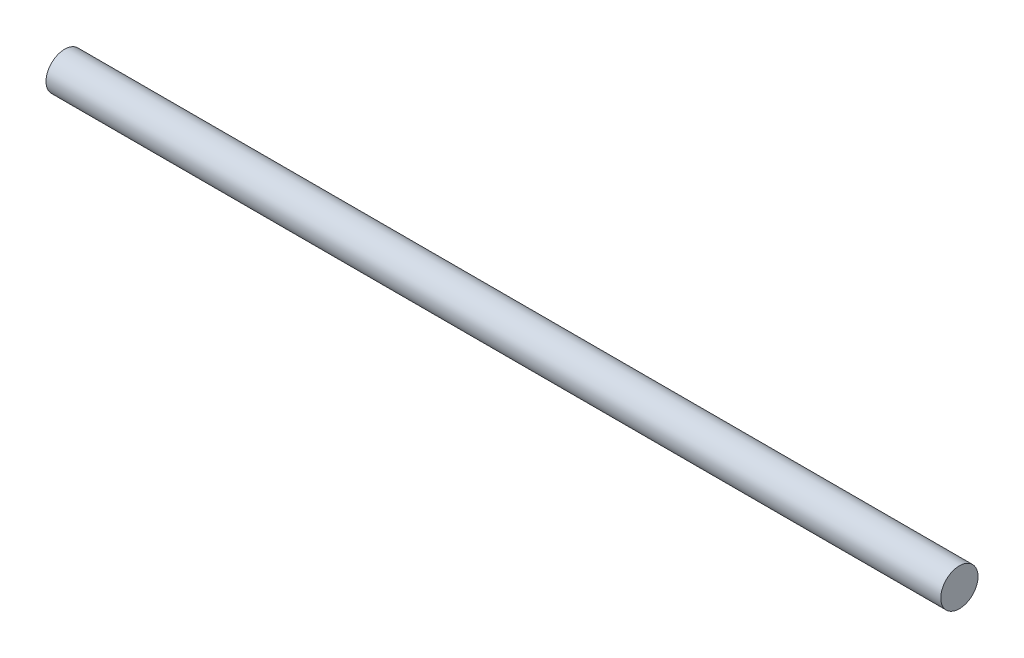
ISO-10303-21;
HEADER;
FILE_DESCRIPTION(('STEP AP214'),'2;1');
FILE_NAME('part.step','',(''),(''),'','','');
FILE_SCHEMA(('AUTOMOTIVE_DESIGN { 1 0 10303 214 1 1 1 1 }'));
ENDSEC;
DATA;
#1=APPLICATION_CONTEXT('core data for automotive mechanical design processes');
#2=APPLICATION_PROTOCOL_DEFINITION('international standard','automotive_design',2000,#1);
#3=PRODUCT_CONTEXT('',#1,'mechanical');
#4=PRODUCT('Part','Part','',(#3));
#5=PRODUCT_RELATED_PRODUCT_CATEGORY('part','',(#4));
#6=PRODUCT_DEFINITION_FORMATION('','',#4);
#7=PRODUCT_DEFINITION_CONTEXT('part definition',#1,'design');
#8=PRODUCT_DEFINITION('design','',#6,#7);
#9=PRODUCT_DEFINITION_SHAPE('','',#8);
#10=(LENGTH_UNIT() NAMED_UNIT(*) SI_UNIT(.MILLI.,.METRE.));
#11=(NAMED_UNIT(*) PLANE_ANGLE_UNIT() SI_UNIT($,.RADIAN.));
#12=(NAMED_UNIT(*) SI_UNIT($,.STERADIAN.) SOLID_ANGLE_UNIT());
#13=UNCERTAINTY_MEASURE_WITH_UNIT(LENGTH_MEASURE(1.E-05),#10,'distance_accuracy_value','');
#14=(GEOMETRIC_REPRESENTATION_CONTEXT(3) GLOBAL_UNCERTAINTY_ASSIGNED_CONTEXT((#13)) GLOBAL_UNIT_ASSIGNED_CONTEXT((#10,
#11,#12)) REPRESENTATION_CONTEXT('',''));
#15=CARTESIAN_POINT('',(0.,0.,0.));
#16=DIRECTION('',(0.,0.,1.));
#17=DIRECTION('',(1.,0.,0.));
#18=AXIS2_PLACEMENT_3D('',#15,#16,#17);
#19=CARTESIAN_POINT('',(152.4,0.,0.));
#20=DIRECTION('',(-1.,0.,0.));
#21=DIRECTION('',(0.,0.,1.));
#22=AXIS2_PLACEMENT_3D('',#19,#20,#21);
#23=CYLINDRICAL_SURFACE('',#22,3.175);
#24=CARTESIAN_POINT('',(152.4,0.,0.));
#25=DIRECTION('',(1.,0.,0.));
#26=DIRECTION('',(0.,0.,-1.));
#27=AXIS2_PLACEMENT_3D('',#24,#25,#26);
#28=CIRCLE('',#27,3.175);
#29=CARTESIAN_POINT('',(152.4,0.,3.175));
#30=VERTEX_POINT('',#29);
#31=EDGE_CURVE('E10',#30,#30,#28,.T.);
#32=CARTESIAN_POINT('',(0.,0.,0.));
#33=DIRECTION('',(1.,0.,0.));
#34=DIRECTION('',(0.,0.,-1.));
#35=AXIS2_PLACEMENT_3D('',#32,#33,#34);
#36=CIRCLE('',#35,3.175);
#37=CARTESIAN_POINT('',(0.,0.,3.175));
#38=VERTEX_POINT('',#37);
#39=EDGE_CURVE('E37',#38,#38,#36,.T.);
#40=CARTESIAN_POINT('',(152.4,0.,3.175));
#41=CARTESIAN_POINT('',(150.8125,0.,3.175));
#42=CARTESIAN_POINT('',(149.225,0.,3.175));
#43=CARTESIAN_POINT('',(146.05,0.,3.175));
#44=CARTESIAN_POINT('',(144.4625,0.,3.175));
#45=CARTESIAN_POINT('',(141.2875,0.,3.175));
#46=CARTESIAN_POINT('',(139.7,0.,3.175));
#47=CARTESIAN_POINT('',(136.525,0.,3.175));
#48=CARTESIAN_POINT('',(134.9375,0.,3.175));
#49=CARTESIAN_POINT('',(131.7625,0.,3.175));
#50=CARTESIAN_POINT('',(130.175,0.,3.175));
#51=CARTESIAN_POINT('',(127.,0.,3.175));
#52=CARTESIAN_POINT('',(125.4125,0.,3.175));
#53=CARTESIAN_POINT('',(122.2375,0.,3.175));
#54=CARTESIAN_POINT('',(120.65,0.,3.175));
#55=CARTESIAN_POINT('',(117.475,0.,3.175));
#56=CARTESIAN_POINT('',(115.8875,0.,3.175));
#57=CARTESIAN_POINT('',(112.7125,0.,3.175));
#58=CARTESIAN_POINT('',(111.125,0.,3.175));
#59=CARTESIAN_POINT('',(107.95,0.,3.175));
#60=CARTESIAN_POINT('',(106.3625,0.,3.175));
#61=CARTESIAN_POINT('',(103.1875,0.,3.175));
#62=CARTESIAN_POINT('',(101.6,0.,3.175));
#63=CARTESIAN_POINT('',(98.425,0.,3.175));
#64=CARTESIAN_POINT('',(96.8375,0.,3.175));
#65=CARTESIAN_POINT('',(93.6625,0.,3.175));
#66=CARTESIAN_POINT('',(92.075,0.,3.175));
#67=CARTESIAN_POINT('',(88.9,0.,3.175));
#68=CARTESIAN_POINT('',(87.3125,0.,3.175));
#69=CARTESIAN_POINT('',(84.1375,0.,3.175));
#70=CARTESIAN_POINT('',(82.55,0.,3.175));
#71=CARTESIAN_POINT('',(79.375,0.,3.175));
#72=CARTESIAN_POINT('',(77.7875,0.,3.175));
#73=CARTESIAN_POINT('',(74.6125,0.,3.175));
#74=CARTESIAN_POINT('',(73.025,0.,3.175));
#75=CARTESIAN_POINT('',(69.85,0.,3.175));
#76=CARTESIAN_POINT('',(68.2625,0.,3.175));
#77=CARTESIAN_POINT('',(65.0875,0.,3.175));
#78=CARTESIAN_POINT('',(63.5,0.,3.175));
#79=CARTESIAN_POINT('',(60.325,0.,3.175));
#80=CARTESIAN_POINT('',(58.7375,0.,3.175));
#81=CARTESIAN_POINT('',(55.5625,0.,3.175));
#82=CARTESIAN_POINT('',(53.975,0.,3.175));
#83=CARTESIAN_POINT('',(50.8,0.,3.175));
#84=CARTESIAN_POINT('',(49.2125,0.,3.175));
#85=CARTESIAN_POINT('',(46.0375,0.,3.175));
#86=CARTESIAN_POINT('',(44.45,0.,3.175));
#87=CARTESIAN_POINT('',(41.275,0.,3.175));
#88=CARTESIAN_POINT('',(39.6875,0.,3.175));
#89=CARTESIAN_POINT('',(36.5125,0.,3.175));
#90=CARTESIAN_POINT('',(34.925,0.,3.175));
#91=CARTESIAN_POINT('',(31.75,0.,3.175));
#92=CARTESIAN_POINT('',(30.1625,0.,3.175));
#93=CARTESIAN_POINT('',(26.9875,0.,3.175));
#94=CARTESIAN_POINT('',(25.4,0.,3.175));
#95=CARTESIAN_POINT('',(22.225,0.,3.175));
#96=CARTESIAN_POINT('',(20.6375,0.,3.175));
#97=CARTESIAN_POINT('',(17.4625,0.,3.175));
#98=CARTESIAN_POINT('',(15.875,0.,3.175));
#99=CARTESIAN_POINT('',(12.7,0.,3.175));
#100=CARTESIAN_POINT('',(11.1125,0.,3.175));
#101=CARTESIAN_POINT('',(7.93750000000001,0.,3.175));
#102=CARTESIAN_POINT('',(6.35,0.,3.175));
#103=CARTESIAN_POINT('',(3.175,0.,3.175));
#104=CARTESIAN_POINT('',(1.5875,0.,3.175));
#105=CARTESIAN_POINT('',(0.,0.,3.175));
#106=B_SPLINE_CURVE_WITH_KNOTS('',3,(#40,#41,#42,#43,#44,#45,#46,#47,#48,#49,#50,#51,#52,#53,
#54,#55,#56,#57,#58,#59,#60,#61,#62,#63,#64,#65,#66,#67,#68,#69,#70,#71,#72,#73,#74,#75,#76,#77,
#78,#79,#80,#81,#82,#83,#84,#85,#86,#87,#88,#89,#90,#91,#92,#93,#94,#95,#96,#97,#98,#99,#100,
#101,#102,#103,#104,#105),.UNSPECIFIED.,.F.,.F.,(4,2,2,2,2,2,2,2,2,2,2,2,2,2,2,2,2,2,2,2,2,2,2,
2,2,2,2,2,2,2,2,2,4),(0.,4.7625,9.52500000000001,14.2875,19.05,23.8125,28.575,33.3375,38.1,
42.8625,47.625,52.3875,57.15,61.9125,66.675,71.4375,76.2,80.9625,85.725,90.4875,95.25,100.0125,
104.775,109.5375,114.3,119.0625,123.825,128.5875,133.35,138.1125,142.875,147.6375,152.4),.UNSPECIFIED.);
#107=EDGE_CURVE('BSEAM34',#30,#38,#106,.T.);
#108=ORIENTED_EDGE('',*,*,#31,.F.);
#109=ORIENTED_EDGE('',*,*,#39,.T.);
#110=ORIENTED_EDGE('',*,*,#107,.T.);
#111=ORIENTED_EDGE('',*,*,#107,.F.);
#112=EDGE_LOOP('',(#108,#110,#109,#111));
#113=FACE_BOUND('',#112,.T.);
#114=ADVANCED_FACE('F34',(#113),#23,.T.);
#115=CARTESIAN_POINT('',(152.4,0.,0.));
#116=DIRECTION('',(1.,0.,0.));
#117=DIRECTION('',(0.,0.,-1.));
#118=AXIS2_PLACEMENT_3D('',#115,#116,#117);
#119=PLANE('',#118);
#120=ORIENTED_EDGE('',*,*,#31,.T.);
#121=EDGE_LOOP('',(#120));
#122=FACE_BOUND('',#121,.T.);
#123=ADVANCED_FACE('F49',(#122),#119,.T.);
#124=CARTESIAN_POINT('',(0.,0.,0.));
#125=DIRECTION('',(1.,0.,0.));
#126=DIRECTION('',(0.,0.,-1.));
#127=AXIS2_PLACEMENT_3D('',#124,#125,#126);
#128=PLANE('',#127);
#129=ORIENTED_EDGE('',*,*,#39,.F.);
#130=EDGE_LOOP('',(#129));
#131=FACE_BOUND('',#130,.T.);
#132=ADVANCED_FACE('F47',(#131),#128,.F.);
#133=CLOSED_SHELL('',(#114,#123,#132));
#134=MANIFOLD_SOLID_BREP('B2',#133);
#135=ADVANCED_BREP_SHAPE_REPRESENTATION('',(#18,#134),#14);
#136=SHAPE_DEFINITION_REPRESENTATION(#9,#135);
ENDSEC;
END-ISO-10303-21;
